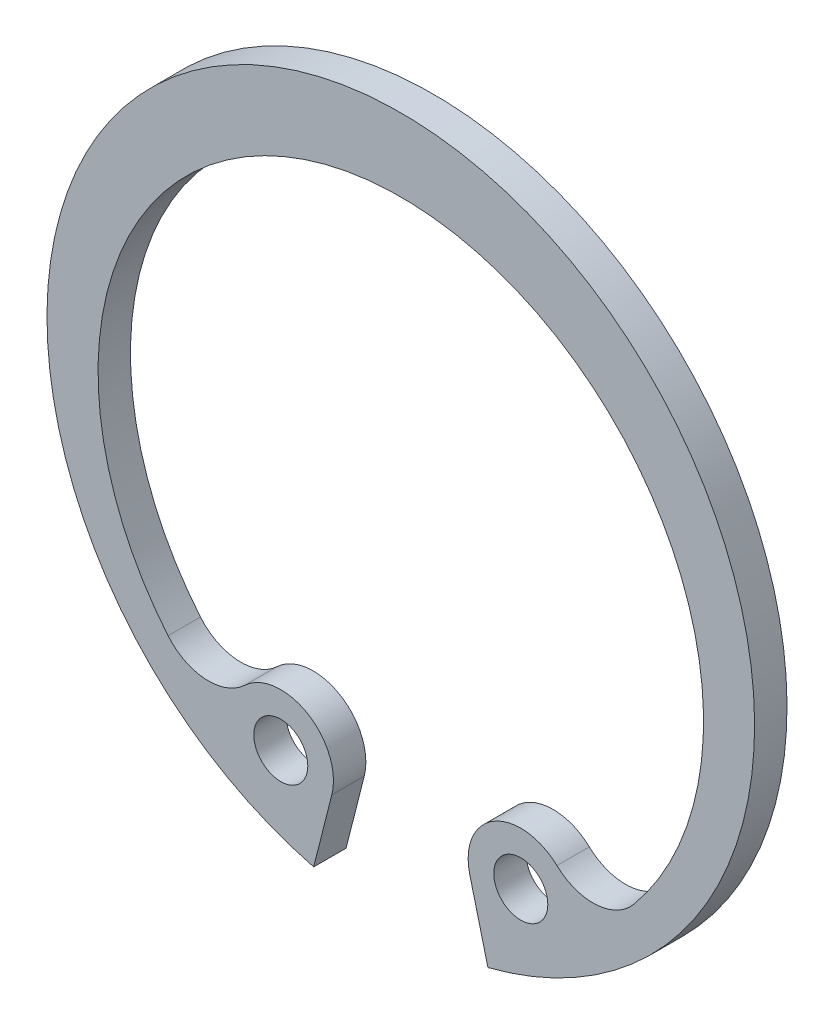
ISO-10303-21;
HEADER;
FILE_DESCRIPTION(('STEP AP214'),'2;1');
FILE_NAME('part.step','',(''),(''),'','','');
FILE_SCHEMA(('AUTOMOTIVE_DESIGN { 1 0 10303 214 1 1 1 1 }'));
ENDSEC;
DATA;
#1=APPLICATION_CONTEXT('core data for automotive mechanical design processes');
#2=APPLICATION_PROTOCOL_DEFINITION('international standard','automotive_design',2000,#1);
#3=PRODUCT_CONTEXT('',#1,'mechanical');
#4=PRODUCT('Part','Part','',(#3));
#5=PRODUCT_RELATED_PRODUCT_CATEGORY('part','',(#4));
#6=PRODUCT_DEFINITION_FORMATION('','',#4);
#7=PRODUCT_DEFINITION_CONTEXT('part definition',#1,'design');
#8=PRODUCT_DEFINITION('design','',#6,#7);
#9=PRODUCT_DEFINITION_SHAPE('','',#8);
#10=(LENGTH_UNIT() NAMED_UNIT(*) SI_UNIT(.MILLI.,.METRE.));
#11=(NAMED_UNIT(*) PLANE_ANGLE_UNIT() SI_UNIT($,.RADIAN.));
#12=(NAMED_UNIT(*) SI_UNIT($,.STERADIAN.) SOLID_ANGLE_UNIT());
#13=UNCERTAINTY_MEASURE_WITH_UNIT(LENGTH_MEASURE(1.E-05),#10,'distance_accuracy_value','');
#14=(GEOMETRIC_REPRESENTATION_CONTEXT(3) GLOBAL_UNCERTAINTY_ASSIGNED_CONTEXT((#13)) GLOBAL_UNIT_ASSIGNED_CONTEXT((#10,
#11,#12)) REPRESENTATION_CONTEXT('',''));
#15=CARTESIAN_POINT('',(0.,0.,0.));
#16=DIRECTION('',(0.,0.,1.));
#17=DIRECTION('',(1.,0.,0.));
#18=AXIS2_PLACEMENT_3D('',#15,#16,#17);
#19=CARTESIAN_POINT('',(0.,0.,-1.2));
#20=DIRECTION('',(0.,0.,1.));
#21=DIRECTION('',(1.,0.,0.));
#22=AXIS2_PLACEMENT_3D('',#19,#20,#21);
#23=CYLINDRICAL_SURFACE('',#22,13.1);
#24=CARTESIAN_POINT('',(0.,0.,0.));
#25=DIRECTION('',(0.,0.,1.));
#26=DIRECTION('',(1.,0.,0.));
#27=AXIS2_PLACEMENT_3D('',#24,#25,#26);
#28=CIRCLE('',#27,13.1);
#29=CARTESIAN_POINT('',(3.22587684287334,-12.6966026398645,0.));
#30=VERTEX_POINT('',#29);
#31=CARTESIAN_POINT('',(-3.22587684287333,-12.6966026398645,0.));
#32=VERTEX_POINT('',#31);
#33=EDGE_CURVE('E130',#30,#32,#28,.T.);
#34=ORIENTED_EDGE('',*,*,#33,.F.);
#35=DIRECTION('',(0.,0.,1.));
#36=VECTOR('',#35,1.);
#37=CARTESIAN_POINT('',(3.22587684287334,-12.6966026398645,-1.2));
#38=LINE('',#37,#36);
#39=CARTESIAN_POINT('',(3.22587684287334,-12.6966026398645,-1.2));
#40=VERTEX_POINT('',#39);
#41=EDGE_CURVE('E11',#40,#30,#38,.T.);
#42=ORIENTED_EDGE('',*,*,#41,.F.);
#43=CARTESIAN_POINT('',(0.,0.,-1.2));
#44=DIRECTION('',(0.,0.,1.));
#45=DIRECTION('',(1.,0.,0.));
#46=AXIS2_PLACEMENT_3D('',#43,#44,#45);
#47=CIRCLE('',#46,13.1);
#48=CARTESIAN_POINT('',(-3.22587684287333,-12.6966026398645,-1.2));
#49=VERTEX_POINT('',#48);
#50=EDGE_CURVE('E151',#40,#49,#47,.T.);
#51=ORIENTED_EDGE('',*,*,#50,.T.);
#52=DIRECTION('',(0.,0.,1.));
#53=VECTOR('',#52,1.);
#54=CARTESIAN_POINT('',(-3.22587684287333,-12.6966026398645,-1.2));
#55=LINE('',#54,#53);
#56=EDGE_CURVE('E36',#49,#32,#55,.T.);
#57=ORIENTED_EDGE('',*,*,#56,.T.);
#58=EDGE_LOOP('',(#34,#42,#51,#57));
#59=FACE_BOUND('',#58,.T.);
#60=ADVANCED_FACE('F33',(#59),#23,.T.);
#61=CARTESIAN_POINT('',(3.22587684287334,-12.6966026398645,-1.2));
#62=DIRECTION('',(-0.969206308386601,-0.246250140677355,0.));
#63=DIRECTION('',(0.246250140677355,-0.969206308386601,0.));
#64=AXIS2_PLACEMENT_3D('',#61,#62,#63);
#65=PLANE('',#64);
#66=DIRECTION('',(0.246250140677355,-0.969206308386601,0.));
#67=VECTOR('',#66,1.);
#68=CARTESIAN_POINT('',(3.22587684287334,-12.6966026398645,0.));
#69=LINE('',#68,#67);
#70=CARTESIAN_POINT('',(2.55317580020233,-10.048944886567,0.));
#71=VERTEX_POINT('',#70);
#72=EDGE_CURVE('E149',#71,#30,#69,.T.);
#73=ORIENTED_EDGE('',*,*,#72,.F.);
#74=DIRECTION('',(0.,0.,1.));
#75=VECTOR('',#74,1.);
#76=CARTESIAN_POINT('',(2.55317580020233,-10.048944886567,-1.2));
#77=LINE('',#76,#75);
#78=CARTESIAN_POINT('',(2.55317580020233,-10.048944886567,-1.2));
#79=VERTEX_POINT('',#78);
#80=EDGE_CURVE('E42',#79,#71,#77,.T.);
#81=ORIENTED_EDGE('',*,*,#80,.F.);
#82=DIRECTION('',(0.246250140677355,-0.969206308386601,0.));
#83=VECTOR('',#82,1.);
#84=CARTESIAN_POINT('',(3.22587684287334,-12.6966026398645,-1.2));
#85=LINE('',#84,#83);
#86=EDGE_CURVE('E120',#79,#40,#85,.T.);
#87=ORIENTED_EDGE('',*,*,#86,.T.);
#88=ORIENTED_EDGE('',*,*,#41,.T.);
#89=EDGE_LOOP('',(#73,#81,#87,#88));
#90=FACE_BOUND('',#89,.T.);
#91=ADVANCED_FACE('F163',(#90),#65,.T.);
#92=CARTESIAN_POINT('',(4.4431281015562,-9.56875711224617,-1.2));
#93=DIRECTION('',(0.,0.,1.));
#94=DIRECTION('',(1.,0.,0.));
#95=AXIS2_PLACEMENT_3D('',#92,#93,#94);
#96=CYLINDRICAL_SURFACE('',#95,1.95);
#97=CARTESIAN_POINT('',(4.4431281015562,-9.56875711224617,0.));
#98=DIRECTION('',(0.,0.,1.));
#99=DIRECTION('',(1.,0.,0.));
#100=AXIS2_PLACEMENT_3D('',#97,#98,#99);
#101=CIRCLE('',#100,1.95);
#102=CARTESIAN_POINT('',(5.78073292215027,-8.14984437922704,0.));
#103=VERTEX_POINT('',#102);
#104=EDGE_CURVE('E107',#103,#71,#101,.T.);
#105=ORIENTED_EDGE('',*,*,#104,.F.);
#106=DIRECTION('',(0.,0.,1.));
#107=VECTOR('',#106,1.);
#108=CARTESIAN_POINT('',(5.78073292215027,-8.14984437922704,-1.2));
#109=LINE('',#108,#107);
#110=CARTESIAN_POINT('',(5.78073292215027,-8.14984437922704,-1.2));
#111=VERTEX_POINT('',#110);
#112=EDGE_CURVE('E102',#111,#103,#109,.T.);
#113=ORIENTED_EDGE('',*,*,#112,.F.);
#114=CARTESIAN_POINT('',(4.4431281015562,-9.56875711224617,-1.2));
#115=DIRECTION('',(0.,0.,1.));
#116=DIRECTION('',(1.,0.,0.));
#117=AXIS2_PLACEMENT_3D('',#114,#115,#116);
#118=CIRCLE('',#117,1.95);
#119=EDGE_CURVE('E105',#111,#79,#118,.T.);
#120=ORIENTED_EDGE('',*,*,#119,.T.);
#121=ORIENTED_EDGE('',*,*,#80,.T.);
#122=EDGE_LOOP('',(#105,#113,#120,#121));
#123=FACE_BOUND('',#122,.T.);
#124=ADVANCED_FACE('F104',(#123),#96,.T.);
#125=CARTESIAN_POINT('',(7.11833774274423,-6.73093164620803,-1.2));
#126=DIRECTION('',(0.,0.,1.));
#127=DIRECTION('',(1.,0.,0.));
#128=AXIS2_PLACEMENT_3D('',#125,#126,#127);
#129=CYLINDRICAL_SURFACE('',#128,1.94999999999991);
#130=CARTESIAN_POINT('',(7.11833774274423,-6.73093164620803,0.));
#131=DIRECTION('',(0.,0.,-1.));
#132=DIRECTION('',(1.,0.,0.));
#133=AXIS2_PLACEMENT_3D('',#130,#131,#132);
#134=CIRCLE('',#133,1.94999999999991);
#135=CARTESIAN_POINT('',(8.61744338577873,-7.97800111942175,0.));
#136=VERTEX_POINT('',#135);
#137=EDGE_CURVE('E146',#136,#103,#134,.T.);
#138=ORIENTED_EDGE('',*,*,#137,.F.);
#139=DIRECTION('',(0.,0.,1.));
#140=VECTOR('',#139,1.);
#141=CARTESIAN_POINT('',(8.61744338577873,-7.97800111942175,-1.2));
#142=LINE('',#141,#140);
#143=CARTESIAN_POINT('',(8.61744338577873,-7.97800111942175,-1.2));
#144=VERTEX_POINT('',#143);
#145=EDGE_CURVE('E112',#144,#136,#142,.T.);
#146=ORIENTED_EDGE('',*,*,#145,.F.);
#147=CARTESIAN_POINT('',(7.11833774274423,-6.73093164620803,-1.2));
#148=DIRECTION('',(0.,0.,-1.));
#149=DIRECTION('',(1.,0.,0.));
#150=AXIS2_PLACEMENT_3D('',#147,#148,#149);
#151=CIRCLE('',#150,1.94999999999991);
#152=EDGE_CURVE('E118',#144,#111,#151,.T.);
#153=ORIENTED_EDGE('',*,*,#152,.T.);
#154=ORIENTED_EDGE('',*,*,#112,.T.);
#155=EDGE_LOOP('',(#138,#146,#153,#154));
#156=FACE_BOUND('',#155,.T.);
#157=ADVANCED_FACE('F122',(#156),#129,.F.);
#158=CARTESIAN_POINT('',(0.,-0.809359847550507,-1.2));
#159=DIRECTION('',(0.,0.,1.));
#160=DIRECTION('',(1.,0.,0.));
#161=AXIS2_PLACEMENT_3D('',#158,#159,#160);
#162=CYLINDRICAL_SURFACE('',#161,11.2093598475505);
#163=CARTESIAN_POINT('',(0.,-0.809359847550507,0.));
#164=DIRECTION('',(0.,0.,-1.));
#165=DIRECTION('',(1.,0.,0.));
#166=AXIS2_PLACEMENT_3D('',#163,#164,#165);
#167=CIRCLE('',#166,11.2093598475505);
#168=CARTESIAN_POINT('',(-8.61744338577875,-7.97800111942174,0.));
#169=VERTEX_POINT('',#168);
#170=EDGE_CURVE('E143',#169,#136,#167,.T.);
#171=ORIENTED_EDGE('',*,*,#170,.F.);
#172=DIRECTION('',(0.,0.,1.));
#173=VECTOR('',#172,1.);
#174=CARTESIAN_POINT('',(-8.61744338577875,-7.97800111942174,-1.2));
#175=LINE('',#174,#173);
#176=CARTESIAN_POINT('',(-8.61744338577875,-7.97800111942174,-1.2));
#177=VERTEX_POINT('',#176);
#178=EDGE_CURVE('E155',#177,#169,#175,.T.);
#179=ORIENTED_EDGE('',*,*,#178,.F.);
#180=CARTESIAN_POINT('',(0.,-0.809359847550507,-1.2));
#181=DIRECTION('',(0.,0.,-1.));
#182=DIRECTION('',(1.,0.,0.));
#183=AXIS2_PLACEMENT_3D('',#180,#181,#182);
#184=CIRCLE('',#183,11.2093598475505);
#185=EDGE_CURVE('E123',#177,#144,#184,.T.);
#186=ORIENTED_EDGE('',*,*,#185,.T.);
#187=ORIENTED_EDGE('',*,*,#145,.T.);
#188=EDGE_LOOP('',(#171,#179,#186,#187));
#189=FACE_BOUND('',#188,.T.);
#190=ADVANCED_FACE('F176',(#189),#162,.F.);
#191=CARTESIAN_POINT('',(-7.11833774274413,-6.73093164620793,-1.2));
#192=DIRECTION('',(0.,0.,1.));
#193=DIRECTION('',(1.,0.,0.));
#194=AXIS2_PLACEMENT_3D('',#191,#192,#193);
#195=CYLINDRICAL_SURFACE('',#194,1.95);
#196=CARTESIAN_POINT('',(-7.11833774274413,-6.73093164620793,0.));
#197=DIRECTION('',(0.,0.,-1.));
#198=DIRECTION('',(1.,0.,0.));
#199=AXIS2_PLACEMENT_3D('',#196,#197,#198);
#200=CIRCLE('',#199,1.95);
#201=CARTESIAN_POINT('',(-5.78073292215017,-8.14984437922705,0.));
#202=VERTEX_POINT('',#201);
#203=EDGE_CURVE('E140',#202,#169,#200,.T.);
#204=ORIENTED_EDGE('',*,*,#203,.F.);
#205=DIRECTION('',(0.,0.,1.));
#206=VECTOR('',#205,1.);
#207=CARTESIAN_POINT('',(-5.78073292215017,-8.14984437922705,-1.2));
#208=LINE('',#207,#206);
#209=CARTESIAN_POINT('',(-5.78073292215017,-8.14984437922705,-1.2));
#210=VERTEX_POINT('',#209);
#211=EDGE_CURVE('E157',#210,#202,#208,.T.);
#212=ORIENTED_EDGE('',*,*,#211,.F.);
#213=CARTESIAN_POINT('',(-7.11833774274413,-6.73093164620793,-1.2));
#214=DIRECTION('',(0.,0.,-1.));
#215=DIRECTION('',(1.,0.,0.));
#216=AXIS2_PLACEMENT_3D('',#213,#214,#215);
#217=CIRCLE('',#216,1.95);
#218=EDGE_CURVE('E125',#210,#177,#217,.T.);
#219=ORIENTED_EDGE('',*,*,#218,.T.);
#220=ORIENTED_EDGE('',*,*,#178,.T.);
#221=EDGE_LOOP('',(#204,#212,#219,#220));
#222=FACE_BOUND('',#221,.T.);
#223=ADVANCED_FACE('F179',(#222),#195,.F.);
#224=CARTESIAN_POINT('',(-4.4431281015562,-9.56875711224616,-1.2));
#225=DIRECTION('',(0.,0.,1.));
#226=DIRECTION('',(1.,0.,0.));
#227=AXIS2_PLACEMENT_3D('',#224,#225,#226);
#228=CYLINDRICAL_SURFACE('',#227,1.95);
#229=CARTESIAN_POINT('',(-4.4431281015562,-9.56875711224616,0.));
#230=DIRECTION('',(0.,0.,1.));
#231=DIRECTION('',(1.,0.,0.));
#232=AXIS2_PLACEMENT_3D('',#229,#230,#231);
#233=CIRCLE('',#232,1.95);
#234=CARTESIAN_POINT('',(-2.55317580020232,-10.048944886567,0.));
#235=VERTEX_POINT('',#234);
#236=EDGE_CURVE('E137',#235,#202,#233,.T.);
#237=ORIENTED_EDGE('',*,*,#236,.F.);
#238=DIRECTION('',(0.,0.,1.));
#239=VECTOR('',#238,1.);
#240=CARTESIAN_POINT('',(-2.55317580020232,-10.048944886567,-1.2));
#241=LINE('',#240,#239);
#242=CARTESIAN_POINT('',(-2.55317580020232,-10.048944886567,-1.2));
#243=VERTEX_POINT('',#242);
#244=EDGE_CURVE('E158',#243,#235,#241,.T.);
#245=ORIENTED_EDGE('',*,*,#244,.F.);
#246=CARTESIAN_POINT('',(-4.4431281015562,-9.56875711224616,-1.2));
#247=DIRECTION('',(0.,0.,1.));
#248=DIRECTION('',(1.,0.,0.));
#249=AXIS2_PLACEMENT_3D('',#246,#247,#248);
#250=CIRCLE('',#249,1.95);
#251=EDGE_CURVE('E225',#243,#210,#250,.T.);
#252=ORIENTED_EDGE('',*,*,#251,.T.);
#253=ORIENTED_EDGE('',*,*,#211,.T.);
#254=EDGE_LOOP('',(#237,#245,#252,#253));
#255=FACE_BOUND('',#254,.T.);
#256=ADVANCED_FACE('F183',(#255),#228,.T.);
#257=CARTESIAN_POINT('',(-3.22587684287333,-12.6966026398645,-1.2));
#258=DIRECTION('',(0.969206308386601,-0.246250140677354,0.));
#259=DIRECTION('',(0.246250140677354,0.969206308386601,0.));
#260=AXIS2_PLACEMENT_3D('',#257,#258,#259);
#261=PLANE('',#260);
#262=DIRECTION('',(0.246250140677354,0.969206308386601,0.));
#263=VECTOR('',#262,1.);
#264=CARTESIAN_POINT('',(-3.22587684287333,-12.6966026398645,0.));
#265=LINE('',#264,#263);
#266=EDGE_CURVE('E133',#32,#235,#265,.T.);
#267=ORIENTED_EDGE('',*,*,#266,.F.);
#268=ORIENTED_EDGE('',*,*,#56,.F.);
#269=DIRECTION('',(0.246250140677354,0.969206308386601,0.));
#270=VECTOR('',#269,1.);
#271=CARTESIAN_POINT('',(-3.22587684287333,-12.6966026398645,-1.2));
#272=LINE('',#271,#270);
#273=EDGE_CURVE('E223',#49,#243,#272,.T.);
#274=ORIENTED_EDGE('',*,*,#273,.T.);
#275=ORIENTED_EDGE('',*,*,#244,.T.);
#276=EDGE_LOOP('',(#267,#268,#274,#275));
#277=FACE_BOUND('',#276,.T.);
#278=ADVANCED_FACE('F160',(#277),#261,.T.);
#279=CARTESIAN_POINT('',(0.,0.,-1.2));
#280=DIRECTION('',(0.,0.,1.));
#281=DIRECTION('',(1.,0.,0.));
#282=AXIS2_PLACEMENT_3D('',#279,#280,#281);
#283=PLANE('',#282);
#284=CARTESIAN_POINT('',(-4.4431281015562,-9.56875711224618,-1.2));
#285=DIRECTION('',(0.,0.,1.));
#286=DIRECTION('',(1.,0.,0.));
#287=AXIS2_PLACEMENT_3D('',#284,#285,#286);
#288=CIRCLE('',#287,1.);
#289=CARTESIAN_POINT('',(-3.4431281015562,-9.56875711224618,-1.2));
#290=VERTEX_POINT('',#289);
#291=EDGE_CURVE('E210',#290,#290,#288,.T.);
#292=ORIENTED_EDGE('',*,*,#291,.T.);
#293=EDGE_LOOP('',(#292));
#294=FACE_BOUND('',#293,.T.);
#295=CARTESIAN_POINT('',(4.4431281015562,-9.56875711224617,-1.2));
#296=DIRECTION('',(0.,0.,1.));
#297=DIRECTION('',(1.,0.,0.));
#298=AXIS2_PLACEMENT_3D('',#295,#296,#297);
#299=CIRCLE('',#298,1.);
#300=CARTESIAN_POINT('',(5.4431281015562,-9.56875711224617,-1.2));
#301=VERTEX_POINT('',#300);
#302=EDGE_CURVE('E134',#301,#301,#299,.T.);
#303=ORIENTED_EDGE('',*,*,#302,.T.);
#304=EDGE_LOOP('',(#303));
#305=FACE_BOUND('',#304,.T.);
#306=ORIENTED_EDGE('',*,*,#50,.F.);
#307=ORIENTED_EDGE('',*,*,#86,.F.);
#308=ORIENTED_EDGE('',*,*,#119,.F.);
#309=ORIENTED_EDGE('',*,*,#152,.F.);
#310=ORIENTED_EDGE('',*,*,#185,.F.);
#311=ORIENTED_EDGE('',*,*,#218,.F.);
#312=ORIENTED_EDGE('',*,*,#251,.F.);
#313=ORIENTED_EDGE('',*,*,#273,.F.);
#314=EDGE_LOOP('',(#306,#307,#308,#309,#310,#311,#312,#313));
#315=FACE_BOUND('',#314,.T.);
#316=ADVANCED_FACE('F116',(#294,#305,#315),#283,.F.);
#317=CARTESIAN_POINT('',(0.,0.,0.));
#318=DIRECTION('',(0.,0.,1.));
#319=DIRECTION('',(1.,0.,0.));
#320=AXIS2_PLACEMENT_3D('',#317,#318,#319);
#321=PLANE('',#320);
#322=CARTESIAN_POINT('',(-4.4431281015562,-9.56875711224618,0.));
#323=DIRECTION('',(0.,0.,1.));
#324=DIRECTION('',(1.,0.,0.));
#325=AXIS2_PLACEMENT_3D('',#322,#323,#324);
#326=CIRCLE('',#325,1.);
#327=CARTESIAN_POINT('',(-3.4431281015562,-9.56875711224618,0.));
#328=VERTEX_POINT('',#327);
#329=EDGE_CURVE('E213',#328,#328,#326,.T.);
#330=ORIENTED_EDGE('',*,*,#329,.F.);
#331=EDGE_LOOP('',(#330));
#332=FACE_BOUND('',#331,.T.);
#333=CARTESIAN_POINT('',(4.4431281015562,-9.56875711224617,0.));
#334=DIRECTION('',(0.,0.,1.));
#335=DIRECTION('',(1.,0.,0.));
#336=AXIS2_PLACEMENT_3D('',#333,#334,#335);
#337=CIRCLE('',#336,1.);
#338=CARTESIAN_POINT('',(5.4431281015562,-9.56875711224617,0.));
#339=VERTEX_POINT('',#338);
#340=EDGE_CURVE('E215',#339,#339,#337,.T.);
#341=ORIENTED_EDGE('',*,*,#340,.F.);
#342=EDGE_LOOP('',(#341));
#343=FACE_BOUND('',#342,.T.);
#344=ORIENTED_EDGE('',*,*,#33,.T.);
#345=ORIENTED_EDGE('',*,*,#266,.T.);
#346=ORIENTED_EDGE('',*,*,#236,.T.);
#347=ORIENTED_EDGE('',*,*,#203,.T.);
#348=ORIENTED_EDGE('',*,*,#170,.T.);
#349=ORIENTED_EDGE('',*,*,#137,.T.);
#350=ORIENTED_EDGE('',*,*,#104,.T.);
#351=ORIENTED_EDGE('',*,*,#72,.T.);
#352=EDGE_LOOP('',(#344,#345,#346,#347,#348,#349,#350,#351));
#353=FACE_BOUND('',#352,.T.);
#354=ADVANCED_FACE('F162',(#332,#343,#353),#321,.T.);
#355=CARTESIAN_POINT('',(4.4431281015562,-9.56875711224617,-1.2));
#356=DIRECTION('',(0.,0.,1.));
#357=DIRECTION('',(1.,0.,0.));
#358=AXIS2_PLACEMENT_3D('',#355,#356,#357);
#359=CYLINDRICAL_SURFACE('',#358,1.);
#360=ORIENTED_EDGE('',*,*,#302,.F.);
#361=EDGE_LOOP('',(#360));
#362=FACE_BOUND('',#361,.T.);
#363=ORIENTED_EDGE('',*,*,#340,.T.);
#364=EDGE_LOOP('',(#363));
#365=FACE_BOUND('',#364,.T.);
#366=ADVANCED_FACE('F195',(#362,#365),#359,.F.);
#367=CARTESIAN_POINT('',(-4.4431281015562,-9.56875711224618,-1.2));
#368=DIRECTION('',(0.,0.,1.));
#369=DIRECTION('',(1.,0.,0.));
#370=AXIS2_PLACEMENT_3D('',#367,#368,#369);
#371=CYLINDRICAL_SURFACE('',#370,1.);
#372=ORIENTED_EDGE('',*,*,#291,.F.);
#373=EDGE_LOOP('',(#372));
#374=FACE_BOUND('',#373,.T.);
#375=ORIENTED_EDGE('',*,*,#329,.T.);
#376=EDGE_LOOP('',(#375));
#377=FACE_BOUND('',#376,.T.);
#378=ADVANCED_FACE('F202',(#374,#377),#371,.F.);
#379=CLOSED_SHELL('',(#60,#91,#124,#157,#190,#223,#256,#278,#316,#354,#366,#378));
#380=MANIFOLD_SOLID_BREP('B2',#379);
#381=ADVANCED_BREP_SHAPE_REPRESENTATION('',(#18,#380),#14);
#382=SHAPE_DEFINITION_REPRESENTATION(#9,#381);
ENDSEC;
END-ISO-10303-21;
